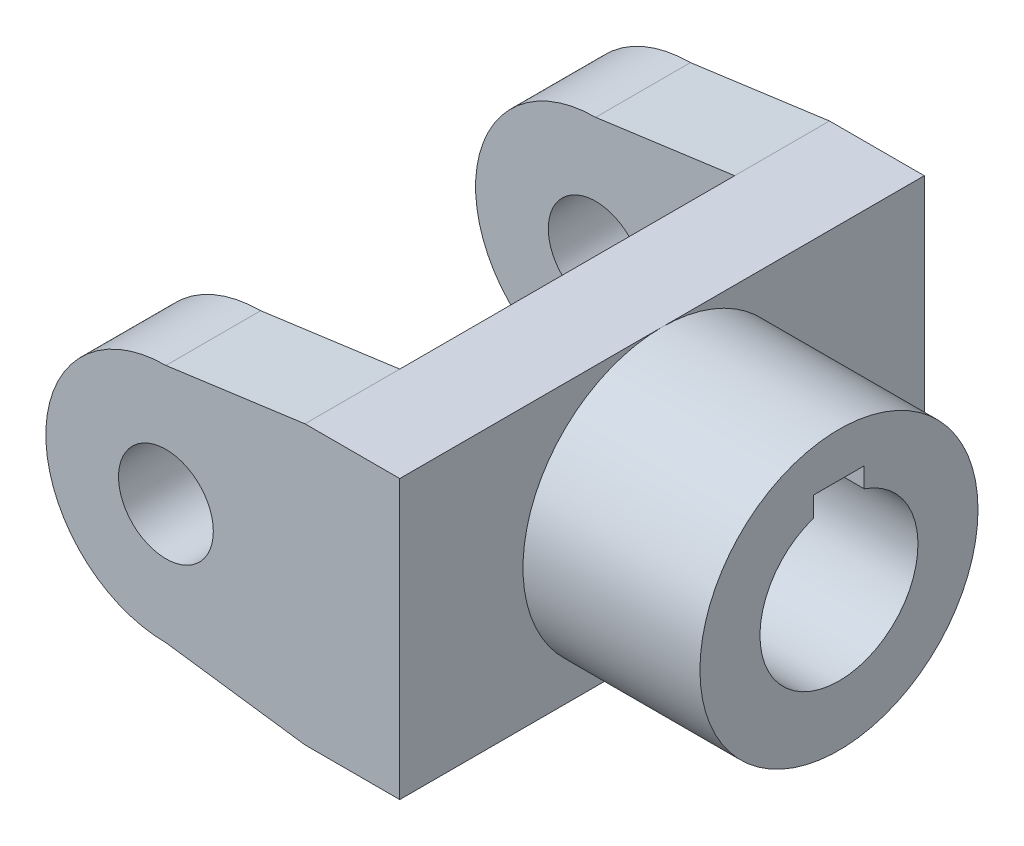
ISO-10303-21;
HEADER;
FILE_DESCRIPTION(('STEP AP214'),'2;1');
FILE_NAME('part.step','',(''),(''),'','','');
FILE_SCHEMA(('AUTOMOTIVE_DESIGN { 1 0 10303 214 1 1 1 1 }'));
ENDSEC;
DATA;
#1=APPLICATION_CONTEXT('core data for automotive mechanical design processes');
#2=APPLICATION_PROTOCOL_DEFINITION('international standard','automotive_design',2000,#1);
#3=PRODUCT_CONTEXT('',#1,'mechanical');
#4=PRODUCT('Part','Part','',(#3));
#5=PRODUCT_RELATED_PRODUCT_CATEGORY('part','',(#4));
#6=PRODUCT_DEFINITION_FORMATION('','',#4);
#7=PRODUCT_DEFINITION_CONTEXT('part definition',#1,'design');
#8=PRODUCT_DEFINITION('design','',#6,#7);
#9=PRODUCT_DEFINITION_SHAPE('','',#8);
#10=(LENGTH_UNIT() NAMED_UNIT(*) SI_UNIT(.MILLI.,.METRE.));
#11=(NAMED_UNIT(*) PLANE_ANGLE_UNIT() SI_UNIT($,.RADIAN.));
#12=(NAMED_UNIT(*) SI_UNIT($,.STERADIAN.) SOLID_ANGLE_UNIT());
#13=UNCERTAINTY_MEASURE_WITH_UNIT(LENGTH_MEASURE(1.E-05),#10,'distance_accuracy_value','');
#14=(GEOMETRIC_REPRESENTATION_CONTEXT(3) GLOBAL_UNCERTAINTY_ASSIGNED_CONTEXT((#13)) GLOBAL_UNIT_ASSIGNED_CONTEXT((#10,
#11,#12)) REPRESENTATION_CONTEXT('',''));
#15=CARTESIAN_POINT('',(0.,0.,0.));
#16=DIRECTION('',(0.,0.,1.));
#17=DIRECTION('',(1.,0.,0.));
#18=AXIS2_PLACEMENT_3D('',#15,#16,#17);
#19=CARTESIAN_POINT('',(28.,0.,44.));
#20=DIRECTION('',(-1.,0.,0.));
#21=DIRECTION('',(0.,0.,1.));
#22=AXIS2_PLACEMENT_3D('',#19,#20,#21);
#23=PLANE('',#22);
#24=CARTESIAN_POINT('',(28.,0.,0.));
#25=DIRECTION('',(1.,0.,0.));
#26=DIRECTION('',(0.,0.,-1.));
#27=AXIS2_PLACEMENT_3D('',#24,#25,#26);
#28=CIRCLE('',#27,44.);
#29=CARTESIAN_POINT('',(28.,0.,-44.));
#30=VERTEX_POINT('',#29);
#31=EDGE_CURVE('E229',#30,#30,#28,.T.);
#32=ORIENTED_EDGE('',*,*,#31,.T.);
#33=EDGE_LOOP('',(#32));
#34=FACE_BOUND('',#33,.T.);
#35=DIRECTION('',(0.,-1.,0.));
#36=VECTOR('',#35,1.);
#37=CARTESIAN_POINT('',(28.,0.,-8.));
#38=LINE('',#37,#36);
#39=CARTESIAN_POINT('',(28.,30.,-8.));
#40=VERTEX_POINT('',#39);
#41=CARTESIAN_POINT('',(28.,23.685438564654,-8.));
#42=VERTEX_POINT('',#41);
#43=EDGE_CURVE('E198',#40,#42,#38,.T.);
#44=ORIENTED_EDGE('',*,*,#43,.T.);
#45=CARTESIAN_POINT('',(28.,0.,0.));
#46=DIRECTION('',(1.,0.,0.));
#47=DIRECTION('',(0.,0.,-1.));
#48=AXIS2_PLACEMENT_3D('',#45,#46,#47);
#49=CIRCLE('',#48,25.);
#50=CARTESIAN_POINT('',(28.,23.685438564654,8.));
#51=VERTEX_POINT('',#50);
#52=EDGE_CURVE('E220',#51,#42,#49,.T.);
#53=ORIENTED_EDGE('',*,*,#52,.F.);
#54=DIRECTION('',(0.,-1.,0.));
#55=VECTOR('',#54,1.);
#56=CARTESIAN_POINT('',(28.,0.,8.));
#57=LINE('',#56,#55);
#58=CARTESIAN_POINT('',(28.,30.,8.));
#59=VERTEX_POINT('',#58);
#60=EDGE_CURVE('E93',#59,#51,#57,.T.);
#61=ORIENTED_EDGE('',*,*,#60,.F.);
#62=DIRECTION('',(0.,0.,-1.));
#63=VECTOR('',#62,1.);
#64=CARTESIAN_POINT('',(28.,30.,0.));
#65=LINE('',#64,#63);
#66=EDGE_CURVE('E190',#59,#40,#65,.T.);
#67=ORIENTED_EDGE('',*,*,#66,.T.);
#68=EDGE_LOOP('',(#44,#53,#61,#67));
#69=FACE_BOUND('',#68,.T.);
#70=ADVANCED_FACE('F77',(#34,#69),#23,.F.);
#71=CARTESIAN_POINT('',(-58.,-83.,53.));
#72=DIRECTION('',(1.,0.,0.));
#73=DIRECTION('',(0.,0.,-1.));
#74=AXIS2_PLACEMENT_3D('',#71,#72,#73);
#75=PLANE('',#74);
#76=DIRECTION('',(0.,1.,0.));
#77=VECTOR('',#76,1.);
#78=CARTESIAN_POINT('',(-58.0000000000001,-83.,-53.));
#79=LINE('',#78,#77);
#80=CARTESIAN_POINT('',(-58.0000000000001,-44.,-53.));
#81=VERTEX_POINT('',#80);
#82=CARTESIAN_POINT('',(-58.0000000000001,44.,-53.));
#83=VERTEX_POINT('',#82);
#84=EDGE_CURVE('E238',#81,#83,#79,.T.);
#85=ORIENTED_EDGE('',*,*,#84,.F.);
#86=DIRECTION('',(0.,0.,-1.));
#87=VECTOR('',#86,1.);
#88=CARTESIAN_POINT('',(-58.,-44.,83.));
#89=LINE('',#88,#87);
#90=CARTESIAN_POINT('',(-58.,-44.,53.));
#91=VERTEX_POINT('',#90);
#92=EDGE_CURVE('E339',#91,#81,#89,.T.);
#93=ORIENTED_EDGE('',*,*,#92,.F.);
#94=DIRECTION('',(0.,1.,0.));
#95=VECTOR('',#94,1.);
#96=CARTESIAN_POINT('',(-58.,-83.,53.));
#97=LINE('',#96,#95);
#98=CARTESIAN_POINT('',(-58.,44.,53.));
#99=VERTEX_POINT('',#98);
#100=EDGE_CURVE('E101',#91,#99,#97,.T.);
#101=ORIENTED_EDGE('',*,*,#100,.T.);
#102=DIRECTION('',(0.,0.,1.));
#103=VECTOR('',#102,1.);
#104=CARTESIAN_POINT('',(-58.,44.,83.0000000000001));
#105=LINE('',#104,#103);
#106=EDGE_CURVE('E264',#83,#99,#105,.T.);
#107=ORIENTED_EDGE('',*,*,#106,.F.);
#108=EDGE_LOOP('',(#85,#93,#101,#107));
#109=FACE_BOUND('',#108,.T.);
#110=DIRECTION('',(0.,-1.,0.));
#111=VECTOR('',#110,1.);
#112=CARTESIAN_POINT('',(-58.,-83.,-8.));
#113=LINE('',#112,#111);
#114=CARTESIAN_POINT('',(-58.,30.,-8.));
#115=VERTEX_POINT('',#114);
#116=CARTESIAN_POINT('',(-58.,23.685438564654,-8.));
#117=VERTEX_POINT('',#116);
#118=EDGE_CURVE('E217',#115,#117,#113,.T.);
#119=ORIENTED_EDGE('',*,*,#118,.F.);
#120=DIRECTION('',(0.,0.,-1.));
#121=VECTOR('',#120,1.);
#122=CARTESIAN_POINT('',(-58.,30.,53.));
#123=LINE('',#122,#121);
#124=CARTESIAN_POINT('',(-58.,30.,8.));
#125=VERTEX_POINT('',#124);
#126=EDGE_CURVE('E12',#125,#115,#123,.T.);
#127=ORIENTED_EDGE('',*,*,#126,.F.);
#128=DIRECTION('',(0.,-1.,0.));
#129=VECTOR('',#128,1.);
#130=CARTESIAN_POINT('',(-58.,-83.,8.));
#131=LINE('',#130,#129);
#132=CARTESIAN_POINT('',(-58.,23.685438564654,8.));
#133=VERTEX_POINT('',#132);
#134=EDGE_CURVE('E212',#125,#133,#131,.T.);
#135=ORIENTED_EDGE('',*,*,#134,.T.);
#136=CARTESIAN_POINT('',(-58.,0.,0.));
#137=DIRECTION('',(1.,0.,0.));
#138=DIRECTION('',(0.,0.,-1.));
#139=AXIS2_PLACEMENT_3D('',#136,#137,#138);
#140=CIRCLE('',#139,25.);
#141=EDGE_CURVE('E223',#133,#117,#140,.T.);
#142=ORIENTED_EDGE('',*,*,#141,.T.);
#143=EDGE_LOOP('',(#119,#127,#135,#142));
#144=FACE_BOUND('',#143,.T.);
#145=ADVANCED_FACE('F400',(#109,#144),#75,.F.);
#146=CARTESIAN_POINT('',(-168.,0.,0.));
#147=DIRECTION('',(1.,0.,0.));
#148=DIRECTION('',(0.,0.,-1.));
#149=AXIS2_PLACEMENT_3D('',#146,#147,#148);
#150=CYLINDRICAL_SURFACE('',#149,25.);
#151=DIRECTION('',(1.,0.,0.));
#152=VECTOR('',#151,1.);
#153=CARTESIAN_POINT('',(-168.,23.685438564654,-8.));
#154=LINE('',#153,#152);
#155=EDGE_CURVE('E86',#117,#42,#154,.T.);
#156=ORIENTED_EDGE('',*,*,#155,.F.);
#157=ORIENTED_EDGE('',*,*,#141,.F.);
#158=DIRECTION('',(1.,0.,0.));
#159=VECTOR('',#158,1.);
#160=CARTESIAN_POINT('',(-168.,23.685438564654,8.));
#161=LINE('',#160,#159);
#162=EDGE_CURVE('E349',#133,#51,#161,.T.);
#163=ORIENTED_EDGE('',*,*,#162,.T.);
#164=ORIENTED_EDGE('',*,*,#52,.T.);
#165=EDGE_LOOP('',(#156,#157,#163,#164));
#166=FACE_BOUND('',#165,.T.);
#167=ADVANCED_FACE('F446',(#166),#150,.F.);
#168=CARTESIAN_POINT('',(0.,-44.,44.));
#169=DIRECTION('',(0.,1.,0.));
#170=DIRECTION('',(0.,0.,1.));
#171=AXIS2_PLACEMENT_3D('',#168,#169,#170);
#172=PLANE('',#171);
#173=DIRECTION('',(0.,0.,-1.));
#174=VECTOR('',#173,1.);
#175=CARTESIAN_POINT('',(-28.,-44.,83.));
#176=LINE('',#175,#174);
#177=CARTESIAN_POINT('',(-28.,-44.,0.));
#178=VERTEX_POINT('',#177);
#179=CARTESIAN_POINT('',(-28.,-44.,-83.));
#180=VERTEX_POINT('',#179);
#181=EDGE_CURVE('E329',#178,#180,#176,.T.);
#182=ORIENTED_EDGE('',*,*,#181,.F.);
#183=CARTESIAN_POINT('',(-28.,-44.,83.));
#184=VERTEX_POINT('',#183);
#185=EDGE_CURVE('E330',#184,#178,#176,.T.);
#186=ORIENTED_EDGE('',*,*,#185,.F.);
#187=DIRECTION('',(1.,0.,0.));
#188=VECTOR('',#187,1.);
#189=CARTESIAN_POINT('',(0.,-44.,83.));
#190=LINE('',#189,#188);
#191=CARTESIAN_POINT('',(-58.,-44.,83.));
#192=VERTEX_POINT('',#191);
#193=EDGE_CURVE('E284',#192,#184,#190,.T.);
#194=ORIENTED_EDGE('',*,*,#193,.F.);
#195=EDGE_CURVE('E334',#192,#91,#89,.T.);
#196=ORIENTED_EDGE('',*,*,#195,.T.);
#197=ORIENTED_EDGE('',*,*,#92,.T.);
#198=CARTESIAN_POINT('',(-58.,-44.,-83.));
#199=VERTEX_POINT('',#198);
#200=EDGE_CURVE('E333',#81,#199,#89,.T.);
#201=ORIENTED_EDGE('',*,*,#200,.T.);
#202=DIRECTION('',(1.,0.,0.));
#203=VECTOR('',#202,1.);
#204=CARTESIAN_POINT('',(0.,-44.,-83.));
#205=LINE('',#204,#203);
#206=EDGE_CURVE('E309',#199,#180,#205,.T.);
#207=ORIENTED_EDGE('',*,*,#206,.T.);
#208=EDGE_LOOP('',(#182,#186,#194,#196,#197,#201,#207));
#209=FACE_BOUND('',#208,.T.);
#210=ADVANCED_FACE('F79',(#209),#172,.F.);
#211=CARTESIAN_POINT('',(0.,44.,44.));
#212=DIRECTION('',(0.,1.,0.));
#213=DIRECTION('',(0.,0.,1.));
#214=AXIS2_PLACEMENT_3D('',#211,#212,#213);
#215=PLANE('',#214);
#216=DIRECTION('',(0.,0.,-1.));
#217=VECTOR('',#216,1.);
#218=CARTESIAN_POINT('',(-28.,44.,83.));
#219=LINE('',#218,#217);
#220=CARTESIAN_POINT('',(-28.,44.,83.));
#221=VERTEX_POINT('',#220);
#222=CARTESIAN_POINT('',(-28.,44.,0.));
#223=VERTEX_POINT('',#222);
#224=EDGE_CURVE('E325',#221,#223,#219,.T.);
#225=ORIENTED_EDGE('',*,*,#224,.T.);
#226=CARTESIAN_POINT('',(-28.,44.,-83.));
#227=VERTEX_POINT('',#226);
#228=EDGE_CURVE('E324',#223,#227,#219,.T.);
#229=ORIENTED_EDGE('',*,*,#228,.T.);
#230=DIRECTION('',(-1.,0.,0.));
#231=VECTOR('',#230,1.);
#232=CARTESIAN_POINT('',(0.,44.,-83.));
#233=LINE('',#232,#231);
#234=CARTESIAN_POINT('',(-58.,44.,-83.));
#235=VERTEX_POINT('',#234);
#236=EDGE_CURVE('E274',#227,#235,#233,.T.);
#237=ORIENTED_EDGE('',*,*,#236,.T.);
#238=DIRECTION('',(0.,0.,-1.));
#239=VECTOR('',#238,1.);
#240=CARTESIAN_POINT('',(-58.,44.,83.));
#241=LINE('',#240,#239);
#242=EDGE_CURVE('E293',#83,#235,#241,.T.);
#243=ORIENTED_EDGE('',*,*,#242,.F.);
#244=ORIENTED_EDGE('',*,*,#106,.T.);
#245=CARTESIAN_POINT('',(-58.,44.,83.));
#246=VERTEX_POINT('',#245);
#247=EDGE_CURVE('E320',#246,#99,#241,.T.);
#248=ORIENTED_EDGE('',*,*,#247,.F.);
#249=DIRECTION('',(-1.,0.,0.));
#250=VECTOR('',#249,1.);
#251=CARTESIAN_POINT('',(0.,44.,83.));
#252=LINE('',#251,#250);
#253=EDGE_CURVE('E290',#221,#246,#252,.T.);
#254=ORIENTED_EDGE('',*,*,#253,.F.);
#255=EDGE_LOOP('',(#225,#229,#237,#243,#244,#248,#254));
#256=FACE_BOUND('',#255,.T.);
#257=ADVANCED_FACE('F377',(#256),#215,.T.);
#258=CARTESIAN_POINT('',(-6.94929006085193,50.9614604462475,83.));
#259=DIRECTION('',(0.135113204733314,-0.990830168044299,0.));
#260=DIRECTION('',(0.990830168044299,0.135113204733314,0.));
#261=AXIS2_PLACEMENT_3D('',#258,#259,#260);
#262=PLANE('',#261);
#263=DIRECTION('',(-0.990830168044299,-0.135113204733314,0.));
#264=VECTOR('',#263,1.);
#265=CARTESIAN_POINT('',(-6.94929006085193,50.9614604462475,-53.));
#266=LINE('',#265,#264);
#267=CARTESIAN_POINT('',(-102.,38.,-53.));
#268=VERTEX_POINT('',#267);
#269=EDGE_CURVE('E261',#83,#268,#266,.T.);
#270=ORIENTED_EDGE('',*,*,#269,.F.);
#271=ORIENTED_EDGE('',*,*,#242,.T.);
#272=DIRECTION('',(-0.990830168044299,-0.135113204733314,0.));
#273=VECTOR('',#272,1.);
#274=CARTESIAN_POINT('',(-6.94929006085193,50.9614604462475,-83.));
#275=LINE('',#274,#273);
#276=CARTESIAN_POINT('',(-102.,38.,-83.));
#277=VERTEX_POINT('',#276);
#278=EDGE_CURVE('E297',#235,#277,#275,.T.);
#279=ORIENTED_EDGE('',*,*,#278,.T.);
#280=DIRECTION('',(0.,0.,-1.));
#281=VECTOR('',#280,1.);
#282=CARTESIAN_POINT('',(-102.,38.,83.));
#283=LINE('',#282,#281);
#284=EDGE_CURVE('E344',#268,#277,#283,.T.);
#285=ORIENTED_EDGE('',*,*,#284,.F.);
#286=EDGE_LOOP('',(#270,#271,#279,#285));
#287=FACE_BOUND('',#286,.T.);
#288=ADVANCED_FACE('F372',(#287),#262,.F.);
#289=CARTESIAN_POINT('',(-102.,0.,83.));
#290=DIRECTION('',(0.,0.,-1.));
#291=DIRECTION('',(-1.,0.,0.));
#292=AXIS2_PLACEMENT_3D('',#289,#290,#291);
#293=CYLINDRICAL_SURFACE('',#292,38.);
#294=DIRECTION('',(0.,0.,-1.));
#295=VECTOR('',#294,1.);
#296=CARTESIAN_POINT('',(-102.,-38.,83.));
#297=LINE('',#296,#295);
#298=CARTESIAN_POINT('',(-102.,-38.,-53.));
#299=VERTEX_POINT('',#298);
#300=CARTESIAN_POINT('',(-102.,-38.,-83.));
#301=VERTEX_POINT('',#300);
#302=EDGE_CURVE('E338',#299,#301,#297,.T.);
#303=ORIENTED_EDGE('',*,*,#302,.F.);
#304=CARTESIAN_POINT('',(-102.,0.,-53.));
#305=DIRECTION('',(0.,0.,1.));
#306=DIRECTION('',(1.,0.,0.));
#307=AXIS2_PLACEMENT_3D('',#304,#305,#306);
#308=CIRCLE('',#307,38.);
#309=EDGE_CURVE('E258',#268,#299,#308,.T.);
#310=ORIENTED_EDGE('',*,*,#309,.F.);
#311=ORIENTED_EDGE('',*,*,#284,.T.);
#312=CARTESIAN_POINT('',(-102.,0.,-83.));
#313=DIRECTION('',(0.,0.,1.));
#314=DIRECTION('',(1.,0.,0.));
#315=AXIS2_PLACEMENT_3D('',#312,#313,#314);
#316=CIRCLE('',#315,38.);
#317=EDGE_CURVE('E301',#277,#301,#316,.T.);
#318=ORIENTED_EDGE('',*,*,#317,.T.);
#319=EDGE_LOOP('',(#303,#310,#311,#318));
#320=FACE_BOUND('',#319,.T.);
#321=ADVANCED_FACE('F386',(#320),#293,.T.);
#322=CARTESIAN_POINT('',(-102.,0.,53.));
#323=DIRECTION('',(0.,0.,1.));
#324=DIRECTION('',(1.,0.,0.));
#325=AXIS2_PLACEMENT_3D('',#322,#323,#324);
#326=CIRCLE('',#325,38.);
#327=CARTESIAN_POINT('',(-102.,38.,53.));
#328=VERTEX_POINT('',#327);
#329=CARTESIAN_POINT('',(-102.,-38.,53.));
#330=VERTEX_POINT('',#329);
#331=EDGE_CURVE('E247',#328,#330,#326,.T.);
#332=ORIENTED_EDGE('',*,*,#331,.T.);
#333=CARTESIAN_POINT('',(-102.,-38.,83.));
#334=VERTEX_POINT('',#333);
#335=EDGE_CURVE('E340',#334,#330,#297,.T.);
#336=ORIENTED_EDGE('',*,*,#335,.F.);
#337=CARTESIAN_POINT('',(-102.,0.,83.));
#338=DIRECTION('',(0.,0.,1.));
#339=DIRECTION('',(1.,0.,0.));
#340=AXIS2_PLACEMENT_3D('',#337,#338,#339);
#341=CIRCLE('',#340,38.);
#342=CARTESIAN_POINT('',(-102.,38.,83.));
#343=VERTEX_POINT('',#342);
#344=EDGE_CURVE('E278',#343,#334,#341,.T.);
#345=ORIENTED_EDGE('',*,*,#344,.F.);
#346=EDGE_CURVE('E345',#343,#328,#283,.T.);
#347=ORIENTED_EDGE('',*,*,#346,.T.);
#348=EDGE_LOOP('',(#332,#336,#345,#347));
#349=FACE_BOUND('',#348,.T.);
#350=ADVANCED_FACE('F413',(#349),#293,.T.);
#351=CARTESIAN_POINT('',(-6.94929006085192,-50.9614604462475,83.));
#352=DIRECTION('',(0.135113204733313,0.990830168044299,0.));
#353=DIRECTION('',(-0.990830168044299,0.135113204733313,0.));
#354=AXIS2_PLACEMENT_3D('',#351,#352,#353);
#355=PLANE('',#354);
#356=DIRECTION('',(0.990830168044299,-0.135113204733313,0.));
#357=VECTOR('',#356,1.);
#358=CARTESIAN_POINT('',(-6.94929006085192,-50.9614604462475,-53.));
#359=LINE('',#358,#357);
#360=EDGE_CURVE('E255',#299,#81,#359,.T.);
#361=ORIENTED_EDGE('',*,*,#360,.F.);
#362=ORIENTED_EDGE('',*,*,#302,.T.);
#363=DIRECTION('',(0.990830168044299,-0.135113204733313,0.));
#364=VECTOR('',#363,1.);
#365=CARTESIAN_POINT('',(-6.94929006085192,-50.9614604462475,-83.));
#366=LINE('',#365,#364);
#367=EDGE_CURVE('E305',#301,#199,#366,.T.);
#368=ORIENTED_EDGE('',*,*,#367,.T.);
#369=ORIENTED_EDGE('',*,*,#200,.F.);
#370=EDGE_LOOP('',(#361,#362,#368,#369));
#371=FACE_BOUND('',#370,.T.);
#372=ADVANCED_FACE('F394',(#371),#355,.F.);
#373=CARTESIAN_POINT('',(-102.,0.,83.));
#374=DIRECTION('',(0.,0.,-1.));
#375=DIRECTION('',(-1.,0.,0.));
#376=AXIS2_PLACEMENT_3D('',#373,#374,#375);
#377=CYLINDRICAL_SURFACE('',#376,15.);
#378=CARTESIAN_POINT('',(-102.,0.,-83.));
#379=DIRECTION('',(0.,0.,1.));
#380=DIRECTION('',(1.,0.,0.));
#381=AXIS2_PLACEMENT_3D('',#378,#379,#380);
#382=CIRCLE('',#381,15.);
#383=CARTESIAN_POINT('',(-87.,0.,-83.));
#384=VERTEX_POINT('',#383);
#385=EDGE_CURVE('E268',#384,#384,#382,.T.);
#386=ORIENTED_EDGE('',*,*,#385,.F.);
#387=EDGE_LOOP('',(#386));
#388=FACE_BOUND('',#387,.T.);
#389=CARTESIAN_POINT('',(-102.,0.,-53.));
#390=DIRECTION('',(0.,0.,1.));
#391=DIRECTION('',(1.,0.,0.));
#392=AXIS2_PLACEMENT_3D('',#389,#390,#391);
#393=CIRCLE('',#392,15.);
#394=CARTESIAN_POINT('',(-87.,0.,-53.));
#395=VERTEX_POINT('',#394);
#396=EDGE_CURVE('E254',#395,#395,#393,.T.);
#397=ORIENTED_EDGE('',*,*,#396,.T.);
#398=EDGE_LOOP('',(#397));
#399=FACE_BOUND('',#398,.T.);
#400=ADVANCED_FACE('F437',(#388,#399),#377,.F.);
#401=CARTESIAN_POINT('',(-28.,0.,83.));
#402=DIRECTION('',(-1.,0.,0.));
#403=DIRECTION('',(0.,0.,1.));
#404=AXIS2_PLACEMENT_3D('',#401,#402,#403);
#405=PLANE('',#404);
#406=ORIENTED_EDGE('',*,*,#185,.T.);
#407=CARTESIAN_POINT('',(-28.,0.,0.));
#408=DIRECTION('',(1.,0.,0.));
#409=DIRECTION('',(0.,0.,-1.));
#410=AXIS2_PLACEMENT_3D('',#407,#408,#409);
#411=CIRCLE('',#410,44.);
#412=EDGE_CURVE('E228',#223,#178,#411,.T.);
#413=ORIENTED_EDGE('',*,*,#412,.F.);
#414=ORIENTED_EDGE('',*,*,#224,.F.);
#415=DIRECTION('',(0.,1.,0.));
#416=VECTOR('',#415,1.);
#417=CARTESIAN_POINT('',(-28.,0.,83.));
#418=LINE('',#417,#416);
#419=EDGE_CURVE('E287',#184,#221,#418,.T.);
#420=ORIENTED_EDGE('',*,*,#419,.F.);
#421=EDGE_LOOP('',(#406,#413,#414,#420));
#422=FACE_BOUND('',#421,.T.);
#423=ADVANCED_FACE('F421',(#422),#405,.F.);
#424=ORIENTED_EDGE('',*,*,#247,.T.);
#425=DIRECTION('',(-0.990830168044299,-0.135113204733314,0.));
#426=VECTOR('',#425,1.);
#427=CARTESIAN_POINT('',(-6.94929006085193,50.9614604462475,53.));
#428=LINE('',#427,#426);
#429=EDGE_CURVE('E250',#99,#328,#428,.T.);
#430=ORIENTED_EDGE('',*,*,#429,.T.);
#431=ORIENTED_EDGE('',*,*,#346,.F.);
#432=DIRECTION('',(-0.990830168044299,-0.135113204733314,0.));
#433=VECTOR('',#432,1.);
#434=CARTESIAN_POINT('',(-6.94929006085193,50.9614604462475,83.));
#435=LINE('',#434,#433);
#436=EDGE_CURVE('E273',#246,#343,#435,.T.);
#437=ORIENTED_EDGE('',*,*,#436,.F.);
#438=EDGE_LOOP('',(#424,#430,#431,#437));
#439=FACE_BOUND('',#438,.T.);
#440=ADVANCED_FACE('F410',(#439),#262,.F.);
#441=ORIENTED_EDGE('',*,*,#335,.T.);
#442=DIRECTION('',(0.990830168044299,-0.135113204733313,0.));
#443=VECTOR('',#442,1.);
#444=CARTESIAN_POINT('',(-6.94929006085192,-50.9614604462475,53.));
#445=LINE('',#444,#443);
#446=EDGE_CURVE('E243',#330,#91,#445,.T.);
#447=ORIENTED_EDGE('',*,*,#446,.T.);
#448=ORIENTED_EDGE('',*,*,#195,.F.);
#449=DIRECTION('',(0.990830168044299,-0.135113204733313,0.));
#450=VECTOR('',#449,1.);
#451=CARTESIAN_POINT('',(-6.94929006085192,-50.9614604462475,83.));
#452=LINE('',#451,#450);
#453=EDGE_CURVE('E281',#334,#192,#452,.T.);
#454=ORIENTED_EDGE('',*,*,#453,.F.);
#455=EDGE_LOOP('',(#441,#447,#448,#454));
#456=FACE_BOUND('',#455,.T.);
#457=ADVANCED_FACE('F403',(#456),#355,.F.);
#458=ORIENTED_EDGE('',*,*,#228,.F.);
#459=CARTESIAN_POINT('',(-28.,0.,0.));
#460=DIRECTION('',(1.,0.,0.));
#461=DIRECTION('',(0.,0.,-1.));
#462=AXIS2_PLACEMENT_3D('',#459,#460,#461);
#463=CIRCLE('',#462,44.);
#464=EDGE_CURVE('E224',#178,#223,#463,.T.);
#465=ORIENTED_EDGE('',*,*,#464,.F.);
#466=ORIENTED_EDGE('',*,*,#181,.T.);
#467=DIRECTION('',(0.,1.,0.));
#468=VECTOR('',#467,1.);
#469=CARTESIAN_POINT('',(-28.,0.,-83.));
#470=LINE('',#469,#468);
#471=EDGE_CURVE('E313',#180,#227,#470,.T.);
#472=ORIENTED_EDGE('',*,*,#471,.T.);
#473=EDGE_LOOP('',(#458,#465,#466,#472));
#474=FACE_BOUND('',#473,.T.);
#475=ADVANCED_FACE('F427',(#474),#405,.F.);
#476=CARTESIAN_POINT('',(-102.,0.,53.));
#477=DIRECTION('',(0.,0.,1.));
#478=DIRECTION('',(1.,0.,0.));
#479=AXIS2_PLACEMENT_3D('',#476,#477,#478);
#480=CIRCLE('',#479,15.);
#481=CARTESIAN_POINT('',(-87.,0.,53.));
#482=VERTEX_POINT('',#481);
#483=EDGE_CURVE('E242',#482,#482,#480,.T.);
#484=ORIENTED_EDGE('',*,*,#483,.F.);
#485=EDGE_LOOP('',(#484));
#486=FACE_BOUND('',#485,.T.);
#487=CARTESIAN_POINT('',(-102.,0.,83.));
#488=DIRECTION('',(0.,0.,1.));
#489=DIRECTION('',(1.,0.,0.));
#490=AXIS2_PLACEMENT_3D('',#487,#488,#489);
#491=CIRCLE('',#490,15.);
#492=CARTESIAN_POINT('',(-87.,0.,83.));
#493=VERTEX_POINT('',#492);
#494=EDGE_CURVE('E269',#493,#493,#491,.T.);
#495=ORIENTED_EDGE('',*,*,#494,.T.);
#496=EDGE_LOOP('',(#495));
#497=FACE_BOUND('',#496,.T.);
#498=ADVANCED_FACE('F429',(#486,#497),#377,.F.);
#499=CARTESIAN_POINT('',(0.,0.,83.));
#500=DIRECTION('',(0.,0.,1.));
#501=DIRECTION('',(1.,0.,0.));
#502=AXIS2_PLACEMENT_3D('',#499,#500,#501);
#503=PLANE('',#502);
#504=ORIENTED_EDGE('',*,*,#494,.F.);
#505=EDGE_LOOP('',(#504));
#506=FACE_BOUND('',#505,.T.);
#507=ORIENTED_EDGE('',*,*,#436,.T.);
#508=ORIENTED_EDGE('',*,*,#344,.T.);
#509=ORIENTED_EDGE('',*,*,#453,.T.);
#510=ORIENTED_EDGE('',*,*,#193,.T.);
#511=ORIENTED_EDGE('',*,*,#419,.T.);
#512=ORIENTED_EDGE('',*,*,#253,.T.);
#513=EDGE_LOOP('',(#507,#508,#509,#510,#511,#512));
#514=FACE_BOUND('',#513,.T.);
#515=ADVANCED_FACE('F415',(#506,#514),#503,.T.);
#516=CARTESIAN_POINT('',(0.,0.,-83.));
#517=DIRECTION('',(0.,0.,1.));
#518=DIRECTION('',(1.,0.,0.));
#519=AXIS2_PLACEMENT_3D('',#516,#517,#518);
#520=PLANE('',#519);
#521=ORIENTED_EDGE('',*,*,#385,.T.);
#522=EDGE_LOOP('',(#521));
#523=FACE_BOUND('',#522,.T.);
#524=ORIENTED_EDGE('',*,*,#278,.F.);
#525=ORIENTED_EDGE('',*,*,#236,.F.);
#526=ORIENTED_EDGE('',*,*,#471,.F.);
#527=ORIENTED_EDGE('',*,*,#206,.F.);
#528=ORIENTED_EDGE('',*,*,#367,.F.);
#529=ORIENTED_EDGE('',*,*,#317,.F.);
#530=EDGE_LOOP('',(#524,#525,#526,#527,#528,#529));
#531=FACE_BOUND('',#530,.T.);
#532=ADVANCED_FACE('F381',(#523,#531),#520,.F.);
#533=CARTESIAN_POINT('',(-140.,-83.,-53.));
#534=DIRECTION('',(0.,0.,1.));
#535=DIRECTION('',(1.,0.,0.));
#536=AXIS2_PLACEMENT_3D('',#533,#534,#535);
#537=PLANE('',#536);
#538=ORIENTED_EDGE('',*,*,#396,.F.);
#539=EDGE_LOOP('',(#538));
#540=FACE_BOUND('',#539,.T.);
#541=ORIENTED_EDGE('',*,*,#269,.T.);
#542=ORIENTED_EDGE('',*,*,#309,.T.);
#543=ORIENTED_EDGE('',*,*,#360,.T.);
#544=ORIENTED_EDGE('',*,*,#84,.T.);
#545=EDGE_LOOP('',(#541,#542,#543,#544));
#546=FACE_BOUND('',#545,.T.);
#547=ADVANCED_FACE('F390',(#540,#546),#537,.T.);
#548=CARTESIAN_POINT('',(-140.,-83.,53.));
#549=DIRECTION('',(0.,0.,1.));
#550=DIRECTION('',(1.,0.,0.));
#551=AXIS2_PLACEMENT_3D('',#548,#549,#550);
#552=PLANE('',#551);
#553=ORIENTED_EDGE('',*,*,#483,.T.);
#554=EDGE_LOOP('',(#553));
#555=FACE_BOUND('',#554,.T.);
#556=ORIENTED_EDGE('',*,*,#100,.F.);
#557=ORIENTED_EDGE('',*,*,#446,.F.);
#558=ORIENTED_EDGE('',*,*,#331,.F.);
#559=ORIENTED_EDGE('',*,*,#429,.F.);
#560=EDGE_LOOP('',(#556,#557,#558,#559));
#561=FACE_BOUND('',#560,.T.);
#562=ADVANCED_FACE('F406',(#555,#561),#552,.F.);
#563=CARTESIAN_POINT('',(-28.,0.,0.));
#564=DIRECTION('',(1.,0.,0.));
#565=DIRECTION('',(0.,0.,-1.));
#566=AXIS2_PLACEMENT_3D('',#563,#564,#565);
#567=CYLINDRICAL_SURFACE('',#566,44.);
#568=ORIENTED_EDGE('',*,*,#31,.F.);
#569=EDGE_LOOP('',(#568));
#570=FACE_BOUND('',#569,.T.);
#571=ORIENTED_EDGE('',*,*,#412,.T.);
#572=ORIENTED_EDGE('',*,*,#464,.T.);
#573=EDGE_LOOP('',(#571,#572));
#574=FACE_BOUND('',#573,.T.);
#575=ADVANCED_FACE('F424',(#570,#574),#567,.T.);
#576=CARTESIAN_POINT('',(-218.,30.,0.));
#577=DIRECTION('',(0.,-1.,0.));
#578=DIRECTION('',(0.,0.,-1.));
#579=AXIS2_PLACEMENT_3D('',#576,#577,#578);
#580=PLANE('',#579);
#581=ORIENTED_EDGE('',*,*,#126,.T.);
#582=DIRECTION('',(1.,0.,0.));
#583=VECTOR('',#582,1.);
#584=CARTESIAN_POINT('',(-218.,30.,-8.));
#585=LINE('',#584,#583);
#586=EDGE_CURVE('E185',#115,#40,#585,.T.);
#587=ORIENTED_EDGE('',*,*,#586,.T.);
#588=ORIENTED_EDGE('',*,*,#66,.F.);
#589=DIRECTION('',(1.,0.,0.));
#590=VECTOR('',#589,1.);
#591=CARTESIAN_POINT('',(-218.,30.,8.));
#592=LINE('',#591,#590);
#593=EDGE_CURVE('E195',#125,#59,#592,.T.);
#594=ORIENTED_EDGE('',*,*,#593,.F.);
#595=EDGE_LOOP('',(#581,#587,#588,#594));
#596=FACE_BOUND('',#595,.T.);
#597=ADVANCED_FACE('F187',(#596),#580,.T.);
#598=CARTESIAN_POINT('',(-218.,0.,-8.));
#599=DIRECTION('',(0.,0.,1.));
#600=DIRECTION('',(1.,0.,0.));
#601=AXIS2_PLACEMENT_3D('',#598,#599,#600);
#602=PLANE('',#601);
#603=ORIENTED_EDGE('',*,*,#118,.T.);
#604=ORIENTED_EDGE('',*,*,#155,.T.);
#605=ORIENTED_EDGE('',*,*,#43,.F.);
#606=ORIENTED_EDGE('',*,*,#586,.F.);
#607=EDGE_LOOP('',(#603,#604,#605,#606));
#608=FACE_BOUND('',#607,.T.);
#609=ADVANCED_FACE('F199',(#608),#602,.T.);
#610=CARTESIAN_POINT('',(-218.,0.,8.));
#611=DIRECTION('',(0.,0.,1.));
#612=DIRECTION('',(1.,0.,0.));
#613=AXIS2_PLACEMENT_3D('',#610,#611,#612);
#614=PLANE('',#613);
#615=ORIENTED_EDGE('',*,*,#593,.T.);
#616=ORIENTED_EDGE('',*,*,#60,.T.);
#617=ORIENTED_EDGE('',*,*,#162,.F.);
#618=ORIENTED_EDGE('',*,*,#134,.F.);
#619=EDGE_LOOP('',(#615,#616,#617,#618));
#620=FACE_BOUND('',#619,.T.);
#621=ADVANCED_FACE('F610',(#620),#614,.F.);
#622=CLOSED_SHELL('',(#70,#145,#167,#210,#257,#288,#321,#350,#372,#400,#423,#440,#457,#475,#498,
#515,#532,#547,#562,#575,#597,#609,#621));
#623=MANIFOLD_SOLID_BREP('B2',#622);
#624=ADVANCED_BREP_SHAPE_REPRESENTATION('',(#18,#623),#14);
#625=SHAPE_DEFINITION_REPRESENTATION(#9,#624);
ENDSEC;
END-ISO-10303-21;
